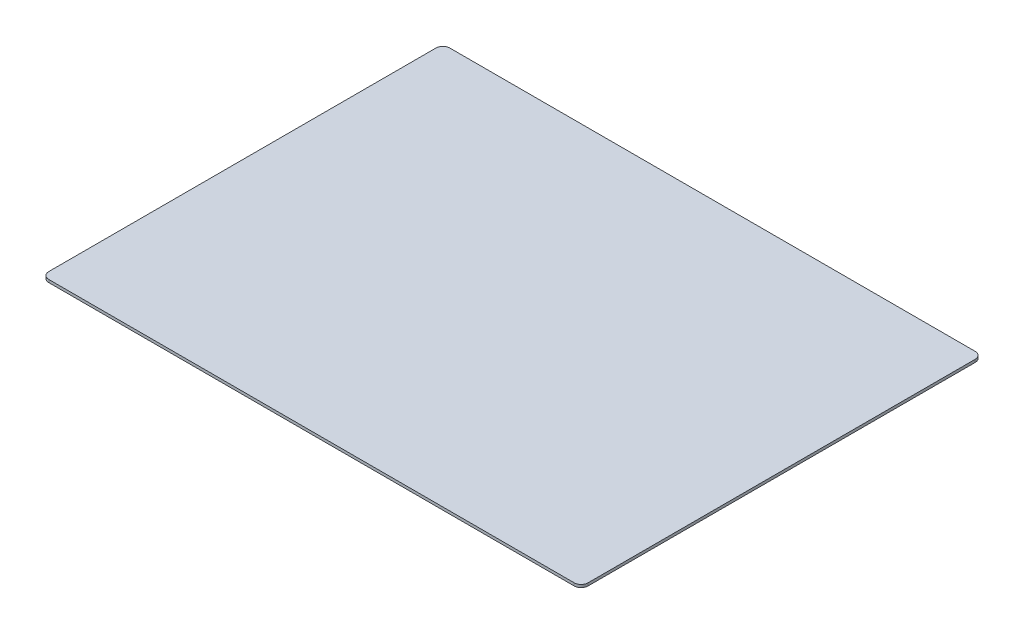
ISO-10303-21;
HEADER;
FILE_DESCRIPTION(('STEP AP214'),'2;1');
FILE_NAME('part.step','',(''),(''),'','','');
FILE_SCHEMA(('AUTOMOTIVE_DESIGN { 1 0 10303 214 1 1 1 1 }'));
ENDSEC;
DATA;
#1=APPLICATION_CONTEXT('core data for automotive mechanical design processes');
#2=APPLICATION_PROTOCOL_DEFINITION('international standard','automotive_design',2000,#1);
#3=PRODUCT_CONTEXT('',#1,'mechanical');
#4=PRODUCT('Part','Part','',(#3));
#5=PRODUCT_RELATED_PRODUCT_CATEGORY('part','',(#4));
#6=PRODUCT_DEFINITION_FORMATION('','',#4);
#7=PRODUCT_DEFINITION_CONTEXT('part definition',#1,'design');
#8=PRODUCT_DEFINITION('design','',#6,#7);
#9=PRODUCT_DEFINITION_SHAPE('','',#8);
#10=(LENGTH_UNIT() NAMED_UNIT(*) SI_UNIT(.MILLI.,.METRE.));
#11=(NAMED_UNIT(*) PLANE_ANGLE_UNIT() SI_UNIT($,.RADIAN.));
#12=(NAMED_UNIT(*) SI_UNIT($,.STERADIAN.) SOLID_ANGLE_UNIT());
#13=UNCERTAINTY_MEASURE_WITH_UNIT(LENGTH_MEASURE(1.E-05),#10,'distance_accuracy_value','');
#14=(GEOMETRIC_REPRESENTATION_CONTEXT(3) GLOBAL_UNCERTAINTY_ASSIGNED_CONTEXT((#13)) GLOBAL_UNIT_ASSIGNED_CONTEXT((#10,
#11,#12)) REPRESENTATION_CONTEXT('',''));
#15=CARTESIAN_POINT('',(0.,0.,0.));
#16=DIRECTION('',(0.,0.,1.));
#17=DIRECTION('',(1.,0.,0.));
#18=AXIS2_PLACEMENT_3D('',#15,#16,#17);
#19=CARTESIAN_POINT('',(195.,2.,145.));
#20=DIRECTION('',(-1.,0.,0.));
#21=DIRECTION('',(0.,0.,1.));
#22=AXIS2_PLACEMENT_3D('',#19,#20,#21);
#23=PLANE('',#22);
#24=DIRECTION('',(0.,0.,-1.));
#25=VECTOR('',#24,1.);
#26=CARTESIAN_POINT('',(195.,0.,145.));
#27=LINE('',#26,#25);
#28=CARTESIAN_POINT('',(195.,0.,140.));
#29=VERTEX_POINT('',#28);
#30=CARTESIAN_POINT('',(195.,0.,-140.));
#31=VERTEX_POINT('',#30);
#32=EDGE_CURVE('E148',#29,#31,#27,.T.);
#33=ORIENTED_EDGE('',*,*,#32,.T.);
#34=DIRECTION('',(0.,-1.,0.));
#35=VECTOR('',#34,1.);
#36=CARTESIAN_POINT('',(195.,2.,-140.));
#37=LINE('',#36,#35);
#38=CARTESIAN_POINT('',(195.,2.,-140.));
#39=VERTEX_POINT('',#38);
#40=EDGE_CURVE('E122',#31,#39,#37,.F.);
#41=ORIENTED_EDGE('',*,*,#40,.T.);
#42=DIRECTION('',(0.,0.,-1.));
#43=VECTOR('',#42,1.);
#44=CARTESIAN_POINT('',(195.,2.,145.));
#45=LINE('',#44,#43);
#46=CARTESIAN_POINT('',(195.,2.,140.));
#47=VERTEX_POINT('',#46);
#48=EDGE_CURVE('E160',#47,#39,#45,.T.);
#49=ORIENTED_EDGE('',*,*,#48,.F.);
#50=DIRECTION('',(0.,-1.,0.));
#51=VECTOR('',#50,1.);
#52=CARTESIAN_POINT('',(195.,2.,140.));
#53=LINE('',#52,#51);
#54=EDGE_CURVE('E128',#47,#29,#53,.T.);
#55=ORIENTED_EDGE('',*,*,#54,.T.);
#56=EDGE_LOOP('',(#33,#41,#49,#55));
#57=FACE_BOUND('',#56,.T.);
#58=ADVANCED_FACE('F49',(#57),#23,.F.);
#59=CARTESIAN_POINT('',(-195.,2.,-145.));
#60=DIRECTION('',(0.,0.,1.));
#61=DIRECTION('',(1.,0.,0.));
#62=AXIS2_PLACEMENT_3D('',#59,#60,#61);
#63=PLANE('',#62);
#64=DIRECTION('',(-1.,0.,0.));
#65=VECTOR('',#64,1.);
#66=CARTESIAN_POINT('',(-195.,2.,-145.));
#67=LINE('',#66,#65);
#68=CARTESIAN_POINT('',(190.,2.,-145.));
#69=VERTEX_POINT('',#68);
#70=CARTESIAN_POINT('',(-190.,2.,-145.));
#71=VERTEX_POINT('',#70);
#72=EDGE_CURVE('E138',#69,#71,#67,.T.);
#73=ORIENTED_EDGE('',*,*,#72,.F.);
#74=DIRECTION('',(0.,-1.,0.));
#75=VECTOR('',#74,1.);
#76=CARTESIAN_POINT('',(190.,2.,-145.));
#77=LINE('',#76,#75);
#78=CARTESIAN_POINT('',(190.,0.,-145.));
#79=VERTEX_POINT('',#78);
#80=EDGE_CURVE('E121',#69,#79,#77,.T.);
#81=ORIENTED_EDGE('',*,*,#80,.T.);
#82=DIRECTION('',(-1.,0.,0.));
#83=VECTOR('',#82,1.);
#84=CARTESIAN_POINT('',(-195.,0.,-145.));
#85=LINE('',#84,#83);
#86=CARTESIAN_POINT('',(-190.,0.,-145.));
#87=VERTEX_POINT('',#86);
#88=EDGE_CURVE('E135',#79,#87,#85,.T.);
#89=ORIENTED_EDGE('',*,*,#88,.T.);
#90=DIRECTION('',(0.,-1.,0.));
#91=VECTOR('',#90,1.);
#92=CARTESIAN_POINT('',(-190.,2.,-145.));
#93=LINE('',#92,#91);
#94=EDGE_CURVE('E141',#87,#71,#93,.F.);
#95=ORIENTED_EDGE('',*,*,#94,.T.);
#96=EDGE_LOOP('',(#73,#81,#89,#95));
#97=FACE_BOUND('',#96,.T.);
#98=ADVANCED_FACE('F134',(#97),#63,.F.);
#99=CARTESIAN_POINT('',(-195.,2.,145.));
#100=DIRECTION('',(1.,0.,0.));
#101=DIRECTION('',(0.,0.,-1.));
#102=AXIS2_PLACEMENT_3D('',#99,#100,#101);
#103=PLANE('',#102);
#104=DIRECTION('',(0.,0.,1.));
#105=VECTOR('',#104,1.);
#106=CARTESIAN_POINT('',(-195.,2.,145.));
#107=LINE('',#106,#105);
#108=CARTESIAN_POINT('',(-195.,2.,-140.));
#109=VERTEX_POINT('',#108);
#110=CARTESIAN_POINT('',(-195.,2.,140.));
#111=VERTEX_POINT('',#110);
#112=EDGE_CURVE('E196',#109,#111,#107,.T.);
#113=ORIENTED_EDGE('',*,*,#112,.F.);
#114=DIRECTION('',(0.,-1.,0.));
#115=VECTOR('',#114,1.);
#116=CARTESIAN_POINT('',(-195.,2.,-140.));
#117=LINE('',#116,#115);
#118=CARTESIAN_POINT('',(-195.,0.,-140.));
#119=VERTEX_POINT('',#118);
#120=EDGE_CURVE('E11',#109,#119,#117,.T.);
#121=ORIENTED_EDGE('',*,*,#120,.T.);
#122=DIRECTION('',(0.,0.,1.));
#123=VECTOR('',#122,1.);
#124=CARTESIAN_POINT('',(-195.,0.,145.));
#125=LINE('',#124,#123);
#126=CARTESIAN_POINT('',(-195.,0.,140.));
#127=VERTEX_POINT('',#126);
#128=EDGE_CURVE('E147',#119,#127,#125,.T.);
#129=ORIENTED_EDGE('',*,*,#128,.T.);
#130=DIRECTION('',(0.,-1.,0.));
#131=VECTOR('',#130,1.);
#132=CARTESIAN_POINT('',(-195.,2.,140.));
#133=LINE('',#132,#131);
#134=EDGE_CURVE('E58',#127,#111,#133,.F.);
#135=ORIENTED_EDGE('',*,*,#134,.T.);
#136=EDGE_LOOP('',(#113,#121,#129,#135));
#137=FACE_BOUND('',#136,.T.);
#138=ADVANCED_FACE('F195',(#137),#103,.F.);
#139=CARTESIAN_POINT('',(-195.,2.,145.));
#140=DIRECTION('',(0.,0.,-1.));
#141=DIRECTION('',(-1.,0.,0.));
#142=AXIS2_PLACEMENT_3D('',#139,#140,#141);
#143=PLANE('',#142);
#144=DIRECTION('',(1.,0.,0.));
#145=VECTOR('',#144,1.);
#146=CARTESIAN_POINT('',(-195.,0.,145.));
#147=LINE('',#146,#145);
#148=CARTESIAN_POINT('',(-190.,0.,145.));
#149=VERTEX_POINT('',#148);
#150=CARTESIAN_POINT('',(190.,0.,145.));
#151=VERTEX_POINT('',#150);
#152=EDGE_CURVE('E153',#149,#151,#147,.T.);
#153=ORIENTED_EDGE('',*,*,#152,.T.);
#154=DIRECTION('',(0.,-1.,0.));
#155=VECTOR('',#154,1.);
#156=CARTESIAN_POINT('',(190.,2.,145.));
#157=LINE('',#156,#155);
#158=CARTESIAN_POINT('',(190.,2.,145.));
#159=VERTEX_POINT('',#158);
#160=EDGE_CURVE('E65',#151,#159,#157,.F.);
#161=ORIENTED_EDGE('',*,*,#160,.T.);
#162=DIRECTION('',(1.,0.,0.));
#163=VECTOR('',#162,1.);
#164=CARTESIAN_POINT('',(-195.,2.,145.));
#165=LINE('',#164,#163);
#166=CARTESIAN_POINT('',(-190.,2.,145.));
#167=VERTEX_POINT('',#166);
#168=EDGE_CURVE('E162',#167,#159,#165,.T.);
#169=ORIENTED_EDGE('',*,*,#168,.F.);
#170=DIRECTION('',(0.,-1.,0.));
#171=VECTOR('',#170,1.);
#172=CARTESIAN_POINT('',(-190.,2.,145.));
#173=LINE('',#172,#171);
#174=EDGE_CURVE('E186',#167,#149,#173,.T.);
#175=ORIENTED_EDGE('',*,*,#174,.T.);
#176=EDGE_LOOP('',(#153,#161,#169,#175));
#177=FACE_BOUND('',#176,.T.);
#178=ADVANCED_FACE('F206',(#177),#143,.F.);
#179=CARTESIAN_POINT('',(0.,2.,0.));
#180=DIRECTION('',(0.,-1.,0.));
#181=DIRECTION('',(0.,0.,-1.));
#182=AXIS2_PLACEMENT_3D('',#179,#180,#181);
#183=PLANE('',#182);
#184=ORIENTED_EDGE('',*,*,#48,.T.);
#185=CARTESIAN_POINT('',(190.,2.,-140.));
#186=DIRECTION('',(0.,-1.,0.));
#187=DIRECTION('',(0.,0.,-1.));
#188=AXIS2_PLACEMENT_3D('',#185,#186,#187);
#189=CIRCLE('',#188,5.);
#190=EDGE_CURVE('E183',#39,#69,#189,.F.);
#191=ORIENTED_EDGE('',*,*,#190,.T.);
#192=ORIENTED_EDGE('',*,*,#72,.T.);
#193=CARTESIAN_POINT('',(-190.,2.,-140.));
#194=DIRECTION('',(0.,-1.,0.));
#195=DIRECTION('',(0.,0.,-1.));
#196=AXIS2_PLACEMENT_3D('',#193,#194,#195);
#197=CIRCLE('',#196,5.);
#198=EDGE_CURVE('E177',#71,#109,#197,.F.);
#199=ORIENTED_EDGE('',*,*,#198,.T.);
#200=ORIENTED_EDGE('',*,*,#112,.T.);
#201=CARTESIAN_POINT('',(-190.,2.,140.));
#202=DIRECTION('',(0.,-1.,0.));
#203=DIRECTION('',(0.,0.,-1.));
#204=AXIS2_PLACEMENT_3D('',#201,#202,#203);
#205=CIRCLE('',#204,5.);
#206=EDGE_CURVE('E72',#111,#167,#205,.F.);
#207=ORIENTED_EDGE('',*,*,#206,.T.);
#208=ORIENTED_EDGE('',*,*,#168,.T.);
#209=CARTESIAN_POINT('',(190.,2.,140.));
#210=DIRECTION('',(0.,-1.,0.));
#211=DIRECTION('',(0.,0.,-1.));
#212=AXIS2_PLACEMENT_3D('',#209,#210,#211);
#213=CIRCLE('',#212,5.);
#214=EDGE_CURVE('E180',#159,#47,#213,.F.);
#215=ORIENTED_EDGE('',*,*,#214,.T.);
#216=EDGE_LOOP('',(#184,#191,#192,#199,#200,#207,#208,#215));
#217=FACE_BOUND('',#216,.T.);
#218=ADVANCED_FACE('F200',(#217),#183,.F.);
#219=CARTESIAN_POINT('',(0.,0.,0.));
#220=DIRECTION('',(0.,-1.,0.));
#221=DIRECTION('',(0.,0.,-1.));
#222=AXIS2_PLACEMENT_3D('',#219,#220,#221);
#223=PLANE('',#222);
#224=ORIENTED_EDGE('',*,*,#88,.F.);
#225=CARTESIAN_POINT('',(190.,0.,-140.));
#226=DIRECTION('',(0.,-1.,0.));
#227=DIRECTION('',(0.,0.,-1.));
#228=AXIS2_PLACEMENT_3D('',#225,#226,#227);
#229=CIRCLE('',#228,5.);
#230=EDGE_CURVE('E117',#79,#31,#229,.T.);
#231=ORIENTED_EDGE('',*,*,#230,.T.);
#232=ORIENTED_EDGE('',*,*,#32,.F.);
#233=CARTESIAN_POINT('',(190.,0.,140.));
#234=DIRECTION('',(0.,-1.,0.));
#235=DIRECTION('',(0.,0.,-1.));
#236=AXIS2_PLACEMENT_3D('',#233,#234,#235);
#237=CIRCLE('',#236,5.);
#238=EDGE_CURVE('E129',#29,#151,#237,.T.);
#239=ORIENTED_EDGE('',*,*,#238,.T.);
#240=ORIENTED_EDGE('',*,*,#152,.F.);
#241=CARTESIAN_POINT('',(-190.,0.,140.));
#242=DIRECTION('',(0.,-1.,0.));
#243=DIRECTION('',(0.,0.,-1.));
#244=AXIS2_PLACEMENT_3D('',#241,#242,#243);
#245=CIRCLE('',#244,5.);
#246=EDGE_CURVE('E140',#149,#127,#245,.T.);
#247=ORIENTED_EDGE('',*,*,#246,.T.);
#248=ORIENTED_EDGE('',*,*,#128,.F.);
#249=CARTESIAN_POINT('',(-190.,0.,-140.));
#250=DIRECTION('',(0.,-1.,0.));
#251=DIRECTION('',(0.,0.,-1.));
#252=AXIS2_PLACEMENT_3D('',#249,#250,#251);
#253=CIRCLE('',#252,5.);
#254=EDGE_CURVE('E145',#119,#87,#253,.T.);
#255=ORIENTED_EDGE('',*,*,#254,.T.);
#256=EDGE_LOOP('',(#224,#231,#232,#239,#240,#247,#248,#255));
#257=FACE_BOUND('',#256,.T.);
#258=ADVANCED_FACE('F143',(#257),#223,.T.);
#259=CARTESIAN_POINT('',(190.,2.,-140.));
#260=DIRECTION('',(0.,-1.,0.));
#261=DIRECTION('',(0.,0.,-1.));
#262=AXIS2_PLACEMENT_3D('',#259,#260,#261);
#263=CYLINDRICAL_SURFACE('',#262,5.);
#264=ORIENTED_EDGE('',*,*,#190,.F.);
#265=ORIENTED_EDGE('',*,*,#40,.F.);
#266=ORIENTED_EDGE('',*,*,#230,.F.);
#267=ORIENTED_EDGE('',*,*,#80,.F.);
#268=EDGE_LOOP('',(#264,#265,#266,#267));
#269=FACE_BOUND('',#268,.T.);
#270=ADVANCED_FACE('F120',(#269),#263,.T.);
#271=CARTESIAN_POINT('',(190.,2.,140.));
#272=DIRECTION('',(0.,-1.,0.));
#273=DIRECTION('',(0.,0.,-1.));
#274=AXIS2_PLACEMENT_3D('',#271,#272,#273);
#275=CYLINDRICAL_SURFACE('',#274,5.);
#276=ORIENTED_EDGE('',*,*,#214,.F.);
#277=ORIENTED_EDGE('',*,*,#160,.F.);
#278=ORIENTED_EDGE('',*,*,#238,.F.);
#279=ORIENTED_EDGE('',*,*,#54,.F.);
#280=EDGE_LOOP('',(#276,#277,#278,#279));
#281=FACE_BOUND('',#280,.T.);
#282=ADVANCED_FACE('F210',(#281),#275,.T.);
#283=CARTESIAN_POINT('',(-190.,2.,-140.));
#284=DIRECTION('',(0.,-1.,0.));
#285=DIRECTION('',(0.,0.,-1.));
#286=AXIS2_PLACEMENT_3D('',#283,#284,#285);
#287=CYLINDRICAL_SURFACE('',#286,5.);
#288=ORIENTED_EDGE('',*,*,#198,.F.);
#289=ORIENTED_EDGE('',*,*,#94,.F.);
#290=ORIENTED_EDGE('',*,*,#254,.F.);
#291=ORIENTED_EDGE('',*,*,#120,.F.);
#292=EDGE_LOOP('',(#288,#289,#290,#291));
#293=FACE_BOUND('',#292,.T.);
#294=ADVANCED_FACE('F219',(#293),#287,.T.);
#295=CARTESIAN_POINT('',(-190.,2.,140.));
#296=DIRECTION('',(0.,-1.,0.));
#297=DIRECTION('',(0.,0.,-1.));
#298=AXIS2_PLACEMENT_3D('',#295,#296,#297);
#299=CYLINDRICAL_SURFACE('',#298,5.);
#300=ORIENTED_EDGE('',*,*,#206,.F.);
#301=ORIENTED_EDGE('',*,*,#134,.F.);
#302=ORIENTED_EDGE('',*,*,#246,.F.);
#303=ORIENTED_EDGE('',*,*,#174,.F.);
#304=EDGE_LOOP('',(#300,#301,#302,#303));
#305=FACE_BOUND('',#304,.T.);
#306=ADVANCED_FACE('F51',(#305),#299,.T.);
#307=CLOSED_SHELL('',(#58,#98,#138,#178,#218,#258,#270,#282,#294,#306));
#308=MANIFOLD_SOLID_BREP('B2',#307);
#309=ADVANCED_BREP_SHAPE_REPRESENTATION('',(#18,#308),#14);
#310=SHAPE_DEFINITION_REPRESENTATION(#9,#309);
ENDSEC;
END-ISO-10303-21;
